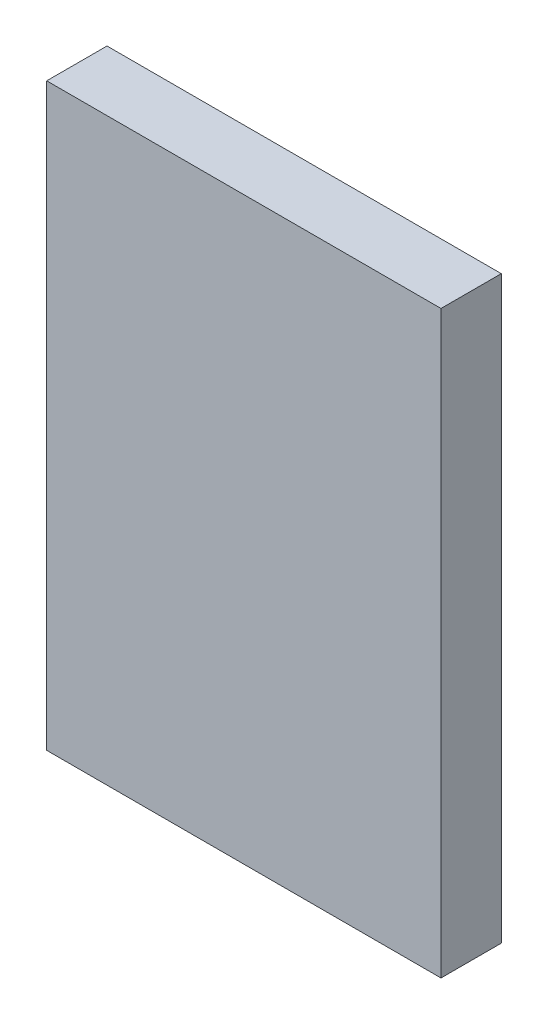
ISO-10303-21;
HEADER;
FILE_DESCRIPTION(('STEP AP214'),'2;1');
FILE_NAME('part.step','',(''),(''),'','','');
FILE_SCHEMA(('AUTOMOTIVE_DESIGN { 1 0 10303 214 1 1 1 1 }'));
ENDSEC;
DATA;
#1=APPLICATION_CONTEXT('core data for automotive mechanical design processes');
#2=APPLICATION_PROTOCOL_DEFINITION('international standard','automotive_design',2000,#1);
#3=PRODUCT_CONTEXT('',#1,'mechanical');
#4=PRODUCT('Part','Part','',(#3));
#5=PRODUCT_RELATED_PRODUCT_CATEGORY('part','',(#4));
#6=PRODUCT_DEFINITION_FORMATION('','',#4);
#7=PRODUCT_DEFINITION_CONTEXT('part definition',#1,'design');
#8=PRODUCT_DEFINITION('design','',#6,#7);
#9=PRODUCT_DEFINITION_SHAPE('','',#8);
#10=(LENGTH_UNIT() NAMED_UNIT(*) SI_UNIT(.MILLI.,.METRE.));
#11=(NAMED_UNIT(*) PLANE_ANGLE_UNIT() SI_UNIT($,.RADIAN.));
#12=(NAMED_UNIT(*) SI_UNIT($,.STERADIAN.) SOLID_ANGLE_UNIT());
#13=UNCERTAINTY_MEASURE_WITH_UNIT(LENGTH_MEASURE(1.E-05),#10,'distance_accuracy_value','');
#14=(GEOMETRIC_REPRESENTATION_CONTEXT(3) GLOBAL_UNCERTAINTY_ASSIGNED_CONTEXT((#13)) GLOBAL_UNIT_ASSIGNED_CONTEXT((#10,
#11,#12)) REPRESENTATION_CONTEXT('',''));
#15=CARTESIAN_POINT('',(0.,0.,0.));
#16=DIRECTION('',(0.,0.,1.));
#17=DIRECTION('',(1.,0.,0.));
#18=AXIS2_PLACEMENT_3D('',#15,#16,#17);
#19=CARTESIAN_POINT('',(22.8754940711463,34.3599725281071,5.2));
#20=DIRECTION('',(-1.,0.,0.));
#21=DIRECTION('',(0.,0.,1.));
#22=AXIS2_PLACEMENT_3D('',#19,#20,#21);
#23=PLANE('',#22);
#24=DIRECTION('',(0.,1.,0.));
#25=VECTOR('',#24,1.);
#26=CARTESIAN_POINT('',(22.8754940711463,34.3599725281071,0.));
#27=LINE('',#26,#25);
#28=CARTESIAN_POINT('',(22.8754940711463,-15.6400274718929,0.));
#29=VERTEX_POINT('',#28);
#30=CARTESIAN_POINT('',(22.8754940711463,34.3599725281071,0.));
#31=VERTEX_POINT('',#30);
#32=EDGE_CURVE('E111',#29,#31,#27,.T.);
#33=ORIENTED_EDGE('',*,*,#32,.T.);
#34=DIRECTION('',(0.,0.,-1.));
#35=VECTOR('',#34,1.);
#36=CARTESIAN_POINT('',(22.8754940711463,34.3599725281071,5.2));
#37=LINE('',#36,#35);
#38=CARTESIAN_POINT('',(22.8754940711463,34.3599725281071,5.2));
#39=VERTEX_POINT('',#38);
#40=EDGE_CURVE('E11',#39,#31,#37,.T.);
#41=ORIENTED_EDGE('',*,*,#40,.F.);
#42=DIRECTION('',(0.,1.,0.));
#43=VECTOR('',#42,1.);
#44=CARTESIAN_POINT('',(22.8754940711463,34.3599725281071,5.2));
#45=LINE('',#44,#43);
#46=CARTESIAN_POINT('',(22.8754940711463,-15.6400274718929,5.2));
#47=VERTEX_POINT('',#46);
#48=EDGE_CURVE('E95',#47,#39,#45,.T.);
#49=ORIENTED_EDGE('',*,*,#48,.F.);
#50=DIRECTION('',(0.,0.,-1.));
#51=VECTOR('',#50,1.);
#52=CARTESIAN_POINT('',(22.8754940711463,-15.6400274718929,5.2));
#53=LINE('',#52,#51);
#54=EDGE_CURVE('E107',#47,#29,#53,.T.);
#55=ORIENTED_EDGE('',*,*,#54,.T.);
#56=EDGE_LOOP('',(#33,#41,#49,#55));
#57=FACE_BOUND('',#56,.T.);
#58=ADVANCED_FACE('F43',(#57),#23,.F.);
#59=CARTESIAN_POINT('',(-11.1245059288538,34.3599725281071,5.2));
#60=DIRECTION('',(0.,-1.,0.));
#61=DIRECTION('',(1.,0.,0.));
#62=AXIS2_PLACEMENT_3D('',#59,#60,#61);
#63=PLANE('',#62);
#64=DIRECTION('',(-1.,0.,0.));
#65=VECTOR('',#64,1.);
#66=CARTESIAN_POINT('',(-11.1245059288538,34.3599725281071,0.));
#67=LINE('',#66,#65);
#68=CARTESIAN_POINT('',(-11.1245059288538,34.3599725281071,0.));
#69=VERTEX_POINT('',#68);
#70=EDGE_CURVE('E100',#31,#69,#67,.T.);
#71=ORIENTED_EDGE('',*,*,#70,.T.);
#72=DIRECTION('',(0.,0.,-1.));
#73=VECTOR('',#72,1.);
#74=CARTESIAN_POINT('',(-11.1245059288538,34.3599725281071,5.2));
#75=LINE('',#74,#73);
#76=CARTESIAN_POINT('',(-11.1245059288538,34.3599725281071,5.2));
#77=VERTEX_POINT('',#76);
#78=EDGE_CURVE('E52',#77,#69,#75,.T.);
#79=ORIENTED_EDGE('',*,*,#78,.F.);
#80=DIRECTION('',(-1.,0.,0.));
#81=VECTOR('',#80,1.);
#82=CARTESIAN_POINT('',(-11.1245059288538,34.3599725281071,5.2));
#83=LINE('',#82,#81);
#84=EDGE_CURVE('E90',#39,#77,#83,.T.);
#85=ORIENTED_EDGE('',*,*,#84,.F.);
#86=ORIENTED_EDGE('',*,*,#40,.T.);
#87=EDGE_LOOP('',(#71,#79,#85,#86));
#88=FACE_BOUND('',#87,.T.);
#89=ADVANCED_FACE('F99',(#88),#63,.F.);
#90=CARTESIAN_POINT('',(-11.1245059288538,34.3599725281071,5.2));
#91=DIRECTION('',(1.,0.,0.));
#92=DIRECTION('',(0.,1.,0.));
#93=AXIS2_PLACEMENT_3D('',#90,#91,#92);
#94=PLANE('',#93);
#95=DIRECTION('',(0.,-1.,0.));
#96=VECTOR('',#95,1.);
#97=CARTESIAN_POINT('',(-11.1245059288538,34.3599725281071,0.));
#98=LINE('',#97,#96);
#99=CARTESIAN_POINT('',(-11.1245059288538,-15.6400274718929,0.));
#100=VERTEX_POINT('',#99);
#101=EDGE_CURVE('E77',#69,#100,#98,.T.);
#102=ORIENTED_EDGE('',*,*,#101,.T.);
#103=DIRECTION('',(0.,0.,-1.));
#104=VECTOR('',#103,1.);
#105=CARTESIAN_POINT('',(-11.1245059288538,-15.6400274718929,5.2));
#106=LINE('',#105,#104);
#107=CARTESIAN_POINT('',(-11.1245059288538,-15.6400274718929,5.2));
#108=VERTEX_POINT('',#107);
#109=EDGE_CURVE('E102',#108,#100,#106,.T.);
#110=ORIENTED_EDGE('',*,*,#109,.F.);
#111=DIRECTION('',(0.,-1.,0.));
#112=VECTOR('',#111,1.);
#113=CARTESIAN_POINT('',(-11.1245059288538,34.3599725281071,5.2));
#114=LINE('',#113,#112);
#115=EDGE_CURVE('E93',#77,#108,#114,.T.);
#116=ORIENTED_EDGE('',*,*,#115,.F.);
#117=ORIENTED_EDGE('',*,*,#78,.T.);
#118=EDGE_LOOP('',(#102,#110,#116,#117));
#119=FACE_BOUND('',#118,.T.);
#120=ADVANCED_FACE('F103',(#119),#94,.F.);
#121=CARTESIAN_POINT('',(-11.1245059288538,-15.6400274718929,5.2));
#122=DIRECTION('',(0.,1.,0.));
#123=DIRECTION('',(0.,0.,1.));
#124=AXIS2_PLACEMENT_3D('',#121,#122,#123);
#125=PLANE('',#124);
#126=DIRECTION('',(1.,0.,0.));
#127=VECTOR('',#126,1.);
#128=CARTESIAN_POINT('',(-11.1245059288538,-15.6400274718929,0.));
#129=LINE('',#128,#127);
#130=EDGE_CURVE('E83',#100,#29,#129,.T.);
#131=ORIENTED_EDGE('',*,*,#130,.T.);
#132=ORIENTED_EDGE('',*,*,#54,.F.);
#133=DIRECTION('',(1.,0.,0.));
#134=VECTOR('',#133,1.);
#135=CARTESIAN_POINT('',(-11.1245059288538,-15.6400274718929,5.2));
#136=LINE('',#135,#134);
#137=EDGE_CURVE('E60',#108,#47,#136,.T.);
#138=ORIENTED_EDGE('',*,*,#137,.F.);
#139=ORIENTED_EDGE('',*,*,#109,.T.);
#140=EDGE_LOOP('',(#131,#132,#138,#139));
#141=FACE_BOUND('',#140,.T.);
#142=ADVANCED_FACE('F124',(#141),#125,.F.);
#143=CARTESIAN_POINT('',(0.,0.,5.2));
#144=DIRECTION('',(0.,0.,1.));
#145=DIRECTION('',(1.,0.,0.));
#146=AXIS2_PLACEMENT_3D('',#143,#144,#145);
#147=PLANE('',#146);
#148=ORIENTED_EDGE('',*,*,#48,.T.);
#149=ORIENTED_EDGE('',*,*,#84,.T.);
#150=ORIENTED_EDGE('',*,*,#115,.T.);
#151=ORIENTED_EDGE('',*,*,#137,.T.);
#152=EDGE_LOOP('',(#148,#149,#150,#151));
#153=FACE_BOUND('',#152,.T.);
#154=ADVANCED_FACE('F91',(#153),#147,.T.);
#155=CARTESIAN_POINT('',(0.,0.,0.));
#156=DIRECTION('',(0.,0.,1.));
#157=DIRECTION('',(1.,0.,0.));
#158=AXIS2_PLACEMENT_3D('',#155,#156,#157);
#159=PLANE('',#158);
#160=ORIENTED_EDGE('',*,*,#32,.F.);
#161=ORIENTED_EDGE('',*,*,#130,.F.);
#162=ORIENTED_EDGE('',*,*,#101,.F.);
#163=ORIENTED_EDGE('',*,*,#70,.F.);
#164=EDGE_LOOP('',(#160,#161,#162,#163));
#165=FACE_BOUND('',#164,.T.);
#166=ADVANCED_FACE('F127',(#165),#159,.F.);
#167=CLOSED_SHELL('',(#58,#89,#120,#142,#154,#166));
#168=MANIFOLD_SOLID_BREP('B2',#167);
#169=ADVANCED_BREP_SHAPE_REPRESENTATION('',(#18,#168),#14);
#170=SHAPE_DEFINITION_REPRESENTATION(#9,#169);
ENDSEC;
END-ISO-10303-21;
